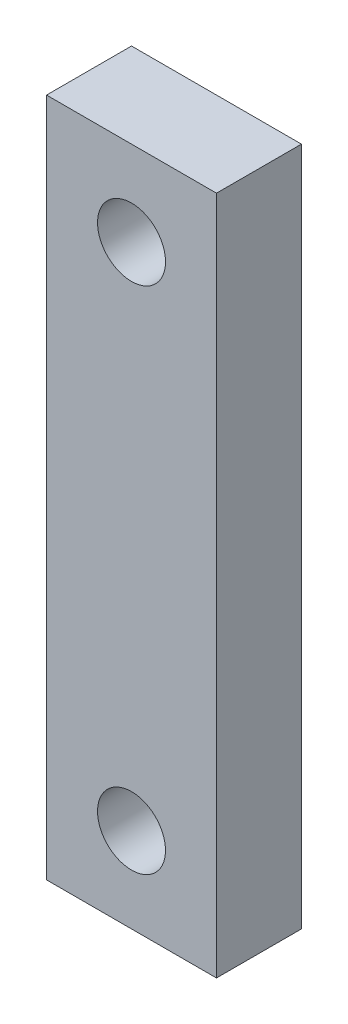
ISO-10303-21;
HEADER;
FILE_DESCRIPTION(('STEP AP214'),'2;1');
FILE_NAME('part.step','',(''),(''),'','','');
FILE_SCHEMA(('AUTOMOTIVE_DESIGN { 1 0 10303 214 1 1 1 1 }'));
ENDSEC;
DATA;
#1=APPLICATION_CONTEXT('core data for automotive mechanical design processes');
#2=APPLICATION_PROTOCOL_DEFINITION('international standard','automotive_design',2000,#1);
#3=PRODUCT_CONTEXT('',#1,'mechanical');
#4=PRODUCT('Part','Part','',(#3));
#5=PRODUCT_RELATED_PRODUCT_CATEGORY('part','',(#4));
#6=PRODUCT_DEFINITION_FORMATION('','',#4);
#7=PRODUCT_DEFINITION_CONTEXT('part definition',#1,'design');
#8=PRODUCT_DEFINITION('design','',#6,#7);
#9=PRODUCT_DEFINITION_SHAPE('','',#8);
#10=(LENGTH_UNIT() NAMED_UNIT(*) SI_UNIT(.MILLI.,.METRE.));
#11=(NAMED_UNIT(*) PLANE_ANGLE_UNIT() SI_UNIT($,.RADIAN.));
#12=(NAMED_UNIT(*) SI_UNIT($,.STERADIAN.) SOLID_ANGLE_UNIT());
#13=UNCERTAINTY_MEASURE_WITH_UNIT(LENGTH_MEASURE(1.E-05),#10,'distance_accuracy_value','');
#14=(GEOMETRIC_REPRESENTATION_CONTEXT(3) GLOBAL_UNCERTAINTY_ASSIGNED_CONTEXT((#13)) GLOBAL_UNIT_ASSIGNED_CONTEXT((#10,
#11,#12)) REPRESENTATION_CONTEXT('',''));
#15=CARTESIAN_POINT('',(0.,0.,0.));
#16=DIRECTION('',(0.,0.,1.));
#17=DIRECTION('',(1.,0.,0.));
#18=AXIS2_PLACEMENT_3D('',#15,#16,#17);
#19=CARTESIAN_POINT('',(0.,0.,10.));
#20=DIRECTION('',(1.,0.,0.));
#21=DIRECTION('',(0.,0.,-1.));
#22=AXIS2_PLACEMENT_3D('',#19,#20,#21);
#23=PLANE('',#22);
#24=DIRECTION('',(0.,-1.,0.));
#25=VECTOR('',#24,1.);
#26=CARTESIAN_POINT('',(0.,0.,0.));
#27=LINE('',#26,#25);
#28=CARTESIAN_POINT('',(0.,80.,0.));
#29=VERTEX_POINT('',#28);
#30=CARTESIAN_POINT('',(0.,0.,0.));
#31=VERTEX_POINT('',#30);
#32=EDGE_CURVE('E107',#29,#31,#27,.T.);
#33=ORIENTED_EDGE('',*,*,#32,.T.);
#34=DIRECTION('',(0.,0.,-1.));
#35=VECTOR('',#34,1.);
#36=CARTESIAN_POINT('',(0.,0.,10.));
#37=LINE('',#36,#35);
#38=CARTESIAN_POINT('',(0.,0.,10.));
#39=VERTEX_POINT('',#38);
#40=EDGE_CURVE('E11',#39,#31,#37,.T.);
#41=ORIENTED_EDGE('',*,*,#40,.F.);
#42=DIRECTION('',(0.,-1.,0.));
#43=VECTOR('',#42,1.);
#44=CARTESIAN_POINT('',(0.,0.,10.));
#45=LINE('',#44,#43);
#46=CARTESIAN_POINT('',(0.,80.,10.));
#47=VERTEX_POINT('',#46);
#48=EDGE_CURVE('E91',#47,#39,#45,.T.);
#49=ORIENTED_EDGE('',*,*,#48,.F.);
#50=DIRECTION('',(0.,0.,-1.));
#51=VECTOR('',#50,1.);
#52=CARTESIAN_POINT('',(0.,80.,10.));
#53=LINE('',#52,#51);
#54=EDGE_CURVE('E103',#47,#29,#53,.T.);
#55=ORIENTED_EDGE('',*,*,#54,.T.);
#56=EDGE_LOOP('',(#33,#41,#49,#55));
#57=FACE_BOUND('',#56,.T.);
#58=ADVANCED_FACE('F39',(#57),#23,.F.);
#59=CARTESIAN_POINT('',(0.,0.,10.));
#60=DIRECTION('',(0.,1.,0.));
#61=DIRECTION('',(0.,0.,1.));
#62=AXIS2_PLACEMENT_3D('',#59,#60,#61);
#63=PLANE('',#62);
#64=DIRECTION('',(1.,0.,0.));
#65=VECTOR('',#64,1.);
#66=CARTESIAN_POINT('',(0.,0.,0.));
#67=LINE('',#66,#65);
#68=CARTESIAN_POINT('',(20.,0.,0.));
#69=VERTEX_POINT('',#68);
#70=EDGE_CURVE('E96',#31,#69,#67,.T.);
#71=ORIENTED_EDGE('',*,*,#70,.T.);
#72=DIRECTION('',(0.,0.,-1.));
#73=VECTOR('',#72,1.);
#74=CARTESIAN_POINT('',(20.,0.,10.));
#75=LINE('',#74,#73);
#76=CARTESIAN_POINT('',(20.,0.,10.));
#77=VERTEX_POINT('',#76);
#78=EDGE_CURVE('E48',#77,#69,#75,.T.);
#79=ORIENTED_EDGE('',*,*,#78,.F.);
#80=DIRECTION('',(1.,0.,0.));
#81=VECTOR('',#80,1.);
#82=CARTESIAN_POINT('',(0.,0.,10.));
#83=LINE('',#82,#81);
#84=EDGE_CURVE('E86',#39,#77,#83,.T.);
#85=ORIENTED_EDGE('',*,*,#84,.F.);
#86=ORIENTED_EDGE('',*,*,#40,.T.);
#87=EDGE_LOOP('',(#71,#79,#85,#86));
#88=FACE_BOUND('',#87,.T.);
#89=ADVANCED_FACE('F95',(#88),#63,.F.);
#90=CARTESIAN_POINT('',(20.,0.,10.));
#91=DIRECTION('',(-1.,0.,0.));
#92=DIRECTION('',(0.,0.,1.));
#93=AXIS2_PLACEMENT_3D('',#90,#91,#92);
#94=PLANE('',#93);
#95=DIRECTION('',(0.,1.,0.));
#96=VECTOR('',#95,1.);
#97=CARTESIAN_POINT('',(20.,0.,0.));
#98=LINE('',#97,#96);
#99=CARTESIAN_POINT('',(20.,80.,0.));
#100=VERTEX_POINT('',#99);
#101=EDGE_CURVE('E73',#69,#100,#98,.T.);
#102=ORIENTED_EDGE('',*,*,#101,.T.);
#103=DIRECTION('',(0.,0.,-1.));
#104=VECTOR('',#103,1.);
#105=CARTESIAN_POINT('',(20.,80.,10.));
#106=LINE('',#105,#104);
#107=CARTESIAN_POINT('',(20.,80.,10.));
#108=VERTEX_POINT('',#107);
#109=EDGE_CURVE('E98',#108,#100,#106,.T.);
#110=ORIENTED_EDGE('',*,*,#109,.F.);
#111=DIRECTION('',(0.,1.,0.));
#112=VECTOR('',#111,1.);
#113=CARTESIAN_POINT('',(20.,0.,10.));
#114=LINE('',#113,#112);
#115=EDGE_CURVE('E89',#77,#108,#114,.T.);
#116=ORIENTED_EDGE('',*,*,#115,.F.);
#117=ORIENTED_EDGE('',*,*,#78,.T.);
#118=EDGE_LOOP('',(#102,#110,#116,#117));
#119=FACE_BOUND('',#118,.T.);
#120=ADVANCED_FACE('F99',(#119),#94,.F.);
#121=CARTESIAN_POINT('',(0.,80.,10.));
#122=DIRECTION('',(0.,-1.,0.));
#123=DIRECTION('',(0.,0.,-1.));
#124=AXIS2_PLACEMENT_3D('',#121,#122,#123);
#125=PLANE('',#124);
#126=DIRECTION('',(-1.,0.,0.));
#127=VECTOR('',#126,1.);
#128=CARTESIAN_POINT('',(0.,80.,0.));
#129=LINE('',#128,#127);
#130=EDGE_CURVE('E79',#100,#29,#129,.T.);
#131=ORIENTED_EDGE('',*,*,#130,.T.);
#132=ORIENTED_EDGE('',*,*,#54,.F.);
#133=DIRECTION('',(-1.,0.,0.));
#134=VECTOR('',#133,1.);
#135=CARTESIAN_POINT('',(0.,80.,10.));
#136=LINE('',#135,#134);
#137=EDGE_CURVE('E56',#108,#47,#136,.T.);
#138=ORIENTED_EDGE('',*,*,#137,.F.);
#139=ORIENTED_EDGE('',*,*,#109,.T.);
#140=EDGE_LOOP('',(#131,#132,#138,#139));
#141=FACE_BOUND('',#140,.T.);
#142=ADVANCED_FACE('F121',(#141),#125,.F.);
#143=CARTESIAN_POINT('',(0.,0.,10.));
#144=DIRECTION('',(0.,0.,-1.));
#145=DIRECTION('',(-1.,0.,0.));
#146=AXIS2_PLACEMENT_3D('',#143,#144,#145);
#147=PLANE('',#146);
#148=CARTESIAN_POINT('',(10.,10.,10.));
#149=DIRECTION('',(0.,0.,1.));
#150=DIRECTION('',(-1.,0.,0.));
#151=AXIS2_PLACEMENT_3D('',#148,#149,#150);
#152=CIRCLE('',#151,4.);
#153=CARTESIAN_POINT('',(6.,10.,10.));
#154=VERTEX_POINT('',#153);
#155=EDGE_CURVE('E136',#154,#154,#152,.T.);
#156=ORIENTED_EDGE('',*,*,#155,.F.);
#157=EDGE_LOOP('',(#156));
#158=FACE_BOUND('',#157,.T.);
#159=CARTESIAN_POINT('',(10.,70.,10.));
#160=DIRECTION('',(0.,0.,1.));
#161=DIRECTION('',(1.,0.,0.));
#162=AXIS2_PLACEMENT_3D('',#159,#160,#161);
#163=CIRCLE('',#162,4.);
#164=CARTESIAN_POINT('',(14.,70.,10.));
#165=VERTEX_POINT('',#164);
#166=EDGE_CURVE('E128',#165,#165,#163,.T.);
#167=ORIENTED_EDGE('',*,*,#166,.F.);
#168=EDGE_LOOP('',(#167));
#169=FACE_BOUND('',#168,.T.);
#170=ORIENTED_EDGE('',*,*,#48,.T.);
#171=ORIENTED_EDGE('',*,*,#84,.T.);
#172=ORIENTED_EDGE('',*,*,#115,.T.);
#173=ORIENTED_EDGE('',*,*,#137,.T.);
#174=EDGE_LOOP('',(#170,#171,#172,#173));
#175=FACE_BOUND('',#174,.T.);
#176=ADVANCED_FACE('F87',(#158,#169,#175),#147,.F.);
#177=CARTESIAN_POINT('',(0.,0.,0.));
#178=DIRECTION('',(0.,0.,-1.));
#179=DIRECTION('',(-1.,0.,0.));
#180=AXIS2_PLACEMENT_3D('',#177,#178,#179);
#181=PLANE('',#180);
#182=CARTESIAN_POINT('',(10.,10.,0.));
#183=DIRECTION('',(0.,0.,1.));
#184=DIRECTION('',(-1.,0.,0.));
#185=AXIS2_PLACEMENT_3D('',#182,#183,#184);
#186=CIRCLE('',#185,4.);
#187=CARTESIAN_POINT('',(6.,10.,0.));
#188=VERTEX_POINT('',#187);
#189=EDGE_CURVE('E132',#188,#188,#186,.T.);
#190=ORIENTED_EDGE('',*,*,#189,.T.);
#191=EDGE_LOOP('',(#190));
#192=FACE_BOUND('',#191,.T.);
#193=CARTESIAN_POINT('',(10.,70.,0.));
#194=DIRECTION('',(0.,0.,1.));
#195=DIRECTION('',(1.,0.,0.));
#196=AXIS2_PLACEMENT_3D('',#193,#194,#195);
#197=CIRCLE('',#196,4.);
#198=CARTESIAN_POINT('',(14.,70.,0.));
#199=VERTEX_POINT('',#198);
#200=EDGE_CURVE('E111',#199,#199,#197,.T.);
#201=ORIENTED_EDGE('',*,*,#200,.T.);
#202=EDGE_LOOP('',(#201));
#203=FACE_BOUND('',#202,.T.);
#204=ORIENTED_EDGE('',*,*,#32,.F.);
#205=ORIENTED_EDGE('',*,*,#130,.F.);
#206=ORIENTED_EDGE('',*,*,#101,.F.);
#207=ORIENTED_EDGE('',*,*,#70,.F.);
#208=EDGE_LOOP('',(#204,#205,#206,#207));
#209=FACE_BOUND('',#208,.T.);
#210=ADVANCED_FACE('F124',(#192,#203,#209),#181,.T.);
#211=CARTESIAN_POINT('',(10.,70.,0.));
#212=DIRECTION('',(0.,0.,1.));
#213=DIRECTION('',(1.,0.,0.));
#214=AXIS2_PLACEMENT_3D('',#211,#212,#213);
#215=CYLINDRICAL_SURFACE('',#214,4.);
#216=ORIENTED_EDGE('',*,*,#200,.F.);
#217=EDGE_LOOP('',(#216));
#218=FACE_BOUND('',#217,.T.);
#219=ORIENTED_EDGE('',*,*,#166,.T.);
#220=EDGE_LOOP('',(#219));
#221=FACE_BOUND('',#220,.T.);
#222=ADVANCED_FACE('F149',(#218,#221),#215,.F.);
#223=CARTESIAN_POINT('',(10.,10.,0.));
#224=DIRECTION('',(0.,0.,1.));
#225=DIRECTION('',(1.,0.,0.));
#226=AXIS2_PLACEMENT_3D('',#223,#224,#225);
#227=CYLINDRICAL_SURFACE('',#226,4.);
#228=ORIENTED_EDGE('',*,*,#189,.F.);
#229=EDGE_LOOP('',(#228));
#230=FACE_BOUND('',#229,.T.);
#231=ORIENTED_EDGE('',*,*,#155,.T.);
#232=EDGE_LOOP('',(#231));
#233=FACE_BOUND('',#232,.T.);
#234=ADVANCED_FACE('F146',(#230,#233),#227,.F.);
#235=CLOSED_SHELL('',(#58,#89,#120,#142,#176,#210,#222,#234));
#236=MANIFOLD_SOLID_BREP('B2',#235);
#237=ADVANCED_BREP_SHAPE_REPRESENTATION('',(#18,#236),#14);
#238=SHAPE_DEFINITION_REPRESENTATION(#9,#237);
ENDSEC;
END-ISO-10303-21;
